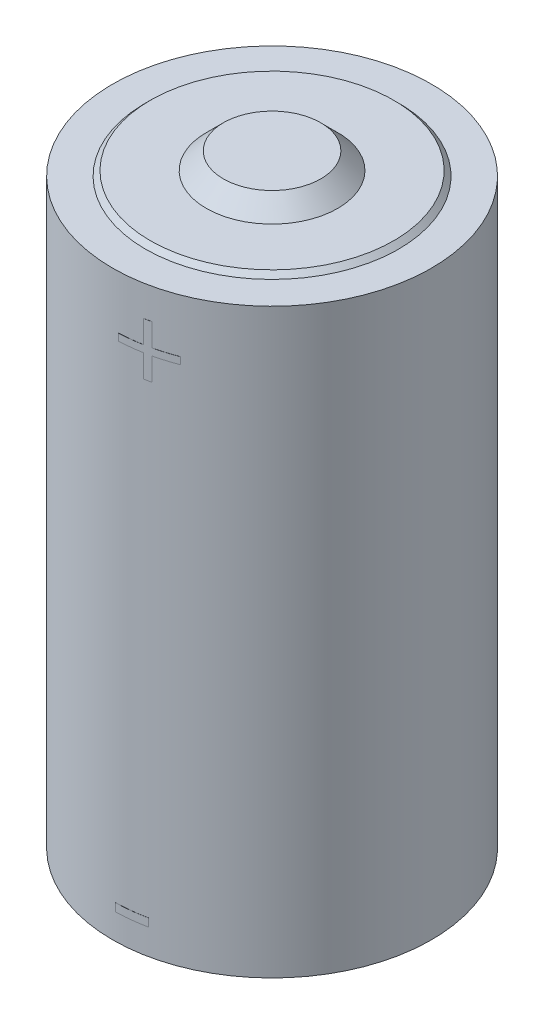
ISO-10303-21;
HEADER;
FILE_DESCRIPTION(('STEP AP214'),'2;1');
FILE_NAME('part.step','',(''),(''),'','','');
FILE_SCHEMA(('AUTOMOTIVE_DESIGN { 1 0 10303 214 1 1 1 1 }'));
ENDSEC;
DATA;
#1=APPLICATION_CONTEXT('core data for automotive mechanical design processes');
#2=APPLICATION_PROTOCOL_DEFINITION('international standard','automotive_design',2000,#1);
#3=PRODUCT_CONTEXT('',#1,'mechanical');
#4=PRODUCT('Part','Part','',(#3));
#5=PRODUCT_RELATED_PRODUCT_CATEGORY('part','',(#4));
#6=PRODUCT_DEFINITION_FORMATION('','',#4);
#7=PRODUCT_DEFINITION_CONTEXT('part definition',#1,'design');
#8=PRODUCT_DEFINITION('design','',#6,#7);
#9=PRODUCT_DEFINITION_SHAPE('','',#8);
#10=(LENGTH_UNIT() NAMED_UNIT(*) SI_UNIT(.MILLI.,.METRE.));
#11=(NAMED_UNIT(*) PLANE_ANGLE_UNIT() SI_UNIT($,.RADIAN.));
#12=(NAMED_UNIT(*) SI_UNIT($,.STERADIAN.) SOLID_ANGLE_UNIT());
#13=UNCERTAINTY_MEASURE_WITH_UNIT(LENGTH_MEASURE(1.E-05),#10,'distance_accuracy_value','');
#14=(GEOMETRIC_REPRESENTATION_CONTEXT(3) GLOBAL_UNCERTAINTY_ASSIGNED_CONTEXT((#13)) GLOBAL_UNIT_ASSIGNED_CONTEXT((#10,
#11,#12)) REPRESENTATION_CONTEXT('',''));
#15=CARTESIAN_POINT('',(0.,0.,0.));
#16=DIRECTION('',(0.,0.,1.));
#17=DIRECTION('',(1.,0.,0.));
#18=AXIS2_PLACEMENT_3D('',#15,#16,#17);
#19=CARTESIAN_POINT('',(0.,0.,0.));
#20=DIRECTION('',(0.,1.,0.));
#21=DIRECTION('',(0.,0.,1.));
#22=AXIS2_PLACEMENT_3D('',#19,#20,#21);
#23=PLANE('',#22);
#24=CARTESIAN_POINT('',(0.,0.,0.));
#25=DIRECTION('',(0.,1.,0.));
#26=DIRECTION('',(0.,0.,1.));
#27=AXIS2_PLACEMENT_3D('',#24,#25,#26);
#28=CIRCLE('',#27,9.40000000000001);
#29=CARTESIAN_POINT('',(0.,0.,9.40000000000001));
#30=VERTEX_POINT('',#29);
#31=EDGE_CURVE('E13',#30,#30,#28,.T.);
#32=ORIENTED_EDGE('',*,*,#31,.T.);
#33=EDGE_LOOP('',(#32));
#34=FACE_BOUND('',#33,.T.);
#35=CARTESIAN_POINT('',(0.,0.,0.));
#36=DIRECTION('',(0.,1.,0.));
#37=DIRECTION('',(0.,0.,1.));
#38=AXIS2_PLACEMENT_3D('',#35,#36,#37);
#39=CIRCLE('',#38,13.1);
#40=CARTESIAN_POINT('',(0.,0.,13.1));
#41=VERTEX_POINT('',#40);
#42=EDGE_CURVE('E387',#41,#41,#39,.T.);
#43=ORIENTED_EDGE('',*,*,#42,.F.);
#44=EDGE_LOOP('',(#43));
#45=FACE_BOUND('',#44,.T.);
#46=ADVANCED_FACE('F98',(#34,#45),#23,.F.);
#47=CARTESIAN_POINT('',(0.,48.2,0.));
#48=DIRECTION('',(0.,1.,0.));
#49=DIRECTION('',(0.,0.,1.));
#50=AXIS2_PLACEMENT_3D('',#47,#48,#49);
#51=PLANE('',#50);
#52=CARTESIAN_POINT('',(0.,48.2,0.));
#53=DIRECTION('',(0.,1.,0.));
#54=DIRECTION('',(0.,0.,1.));
#55=AXIS2_PLACEMENT_3D('',#52,#53,#54);
#56=CIRCLE('',#55,5.4);
#57=CARTESIAN_POINT('',(0.,48.2,5.4));
#58=VERTEX_POINT('',#57);
#59=EDGE_CURVE('E391',#58,#58,#56,.F.);
#60=ORIENTED_EDGE('',*,*,#59,.T.);
#61=EDGE_LOOP('',(#60));
#62=FACE_BOUND('',#61,.T.);
#63=CARTESIAN_POINT('',(0.,48.2,0.));
#64=DIRECTION('',(0.,1.,0.));
#65=DIRECTION('',(0.,0.,1.));
#66=AXIS2_PLACEMENT_3D('',#63,#64,#65);
#67=CIRCLE('',#66,10.);
#68=CARTESIAN_POINT('',(0.,48.2,10.));
#69=VERTEX_POINT('',#68);
#70=EDGE_CURVE('E384',#69,#69,#67,.T.);
#71=ORIENTED_EDGE('',*,*,#70,.T.);
#72=EDGE_LOOP('',(#71));
#73=FACE_BOUND('',#72,.T.);
#74=ADVANCED_FACE('F408',(#62,#73),#51,.T.);
#75=CARTESIAN_POINT('',(0.,47.8,0.));
#76=DIRECTION('',(0.,1.,0.));
#77=DIRECTION('',(0.,0.,1.));
#78=AXIS2_PLACEMENT_3D('',#75,#76,#77);
#79=PLANE('',#78);
#80=CARTESIAN_POINT('',(0.,47.8,0.));
#81=DIRECTION('',(0.,1.,0.));
#82=DIRECTION('',(0.,0.,1.));
#83=AXIS2_PLACEMENT_3D('',#80,#81,#82);
#84=CIRCLE('',#83,10.4);
#85=CARTESIAN_POINT('',(0.,47.8,10.4));
#86=VERTEX_POINT('',#85);
#87=EDGE_CURVE('E106',#86,#86,#84,.F.);
#88=ORIENTED_EDGE('',*,*,#87,.T.);
#89=EDGE_LOOP('',(#88));
#90=FACE_BOUND('',#89,.T.);
#91=CARTESIAN_POINT('',(0.,47.8,0.));
#92=DIRECTION('',(0.,1.,0.));
#93=DIRECTION('',(0.,0.,1.));
#94=AXIS2_PLACEMENT_3D('',#91,#92,#93);
#95=CIRCLE('',#94,13.1);
#96=CARTESIAN_POINT('',(0.,47.8,13.1));
#97=VERTEX_POINT('',#96);
#98=EDGE_CURVE('E388',#97,#97,#95,.T.);
#99=ORIENTED_EDGE('',*,*,#98,.T.);
#100=EDGE_LOOP('',(#99));
#101=FACE_BOUND('',#100,.T.);
#102=ADVANCED_FACE('F398',(#90,#101),#79,.T.);
#103=CARTESIAN_POINT('',(0.,47.8,0.));
#104=DIRECTION('',(0.,-1.,0.));
#105=DIRECTION('',(0.,0.,-1.));
#106=AXIS2_PLACEMENT_3D('',#103,#104,#105);
#107=CYLINDRICAL_SURFACE('',#106,13.1);
#108=CARTESIAN_POINT('',(0.,2.76794871794873,0.));
#109=DIRECTION('',(0.,-1.,0.));
#110=DIRECTION('',(0.0186424901586206,0.,0.9998262136795));
#111=AXIS2_PLACEMENT_3D('',#108,#109,#110);
#112=CIRCLE('',#111,13.1);
#113=CARTESIAN_POINT('',(2.66774650354884,2.76794871794871,12.8254874602412));
#114=VERTEX_POINT('',#113);
#115=CARTESIAN_POINT('',(0.244216621077929,2.76794871794873,13.0977233992015));
#116=VERTEX_POINT('',#115);
#117=EDGE_CURVE('E233',#114,#116,#112,.T.);
#118=ORIENTED_EDGE('',*,*,#117,.F.);
#119=DIRECTION('',(0.,-1.,0.));
#120=VECTOR('',#119,1.);
#121=CARTESIAN_POINT('',(2.66774650354884,2.76794871794873,12.8254874602412));
#122=LINE('',#121,#120);
#123=CARTESIAN_POINT('',(2.66774650354884,2.11666666666668,12.8254874602411));
#124=VERTEX_POINT('',#123);
#125=EDGE_CURVE('E113',#114,#124,#122,.T.);
#126=ORIENTED_EDGE('',*,*,#125,.T.);
#127=CARTESIAN_POINT('',(0.,2.11666666666668,0.));
#128=DIRECTION('',(0.,-1.,0.));
#129=DIRECTION('',(0.0186424901586206,0.,0.9998262136795));
#130=AXIS2_PLACEMENT_3D('',#127,#128,#129);
#131=CIRCLE('',#130,13.1);
#132=CARTESIAN_POINT('',(0.244216621077929,2.11666666666668,13.0977233992015));
#133=VERTEX_POINT('',#132);
#134=EDGE_CURVE('E221',#124,#133,#131,.T.);
#135=ORIENTED_EDGE('',*,*,#134,.T.);
#136=DIRECTION('',(0.,1.,0.));
#137=VECTOR('',#136,1.);
#138=CARTESIAN_POINT('',(0.244216621077929,2.11666666666668,13.0977233992015));
#139=LINE('',#138,#137);
#140=EDGE_CURVE('E239',#133,#116,#139,.T.);
#141=ORIENTED_EDGE('',*,*,#140,.T.);
#142=EDGE_LOOP('',(#118,#126,#135,#141));
#143=FACE_BOUND('',#142,.T.);
#144=DIRECTION('',(0.,1.,0.));
#145=VECTOR('',#144,1.);
#146=CARTESIAN_POINT('',(2.34813797852245,40.9769230769231,12.8878333335678));
#147=LINE('',#146,#145);
#148=CARTESIAN_POINT('',(2.34813797852245,40.9769230769231,12.8878333335678));
#149=VERTEX_POINT('',#148);
#150=CARTESIAN_POINT('',(2.34813797852246,42.849358974359,12.8878333335678));
#151=VERTEX_POINT('',#150);
#152=EDGE_CURVE('E318',#149,#151,#147,.T.);
#153=ORIENTED_EDGE('',*,*,#152,.T.);
#154=CARTESIAN_POINT('',(0.,42.849358974359,0.));
#155=DIRECTION('',(0.,-1.,0.));
#156=DIRECTION('',(0.0372785006977015,0.,0.999304915121372));
#157=AXIS2_PLACEMENT_3D('',#154,#155,#156);
#158=CIRCLE('',#157,13.1);
#159=CARTESIAN_POINT('',(0.48834835913989,42.849358974359,13.09089438809));
#160=VERTEX_POINT('',#159);
#161=EDGE_CURVE('E314',#151,#160,#158,.T.);
#162=ORIENTED_EDGE('',*,*,#161,.T.);
#163=DIRECTION('',(0.,1.,0.));
#164=VECTOR('',#163,1.);
#165=CARTESIAN_POINT('',(0.48834835913989,42.849358974359,13.09089438809));
#166=LINE('',#165,#164);
#167=CARTESIAN_POINT('',(0.48834835913989,43.4192307692308,13.09089438809));
#168=VERTEX_POINT('',#167);
#169=EDGE_CURVE('E310',#160,#168,#166,.T.);
#170=ORIENTED_EDGE('',*,*,#169,.T.);
#171=CARTESIAN_POINT('',(0.,43.4192307692308,0.));
#172=DIRECTION('',(0.,-1.,0.));
#173=DIRECTION('',(0.0372785006977015,0.,0.999304915121372));
#174=AXIS2_PLACEMENT_3D('',#171,#172,#173);
#175=CIRCLE('',#174,13.1);
#176=CARTESIAN_POINT('',(2.34813797852245,43.4192307692308,12.8878333335678));
#177=VERTEX_POINT('',#176);
#178=EDGE_CURVE('E121',#177,#168,#175,.T.);
#179=ORIENTED_EDGE('',*,*,#178,.F.);
#180=DIRECTION('',(0.,1.,0.));
#181=VECTOR('',#180,1.);
#182=CARTESIAN_POINT('',(2.34813797852245,43.4192307692308,12.8878333335678));
#183=LINE('',#182,#181);
#184=CARTESIAN_POINT('',(2.34813797852245,45.2916666666667,12.8878333335678));
#185=VERTEX_POINT('',#184);
#186=EDGE_CURVE('E265',#177,#185,#183,.T.);
#187=ORIENTED_EDGE('',*,*,#186,.T.);
#188=CARTESIAN_POINT('',(0.,45.2916666666667,0.));
#189=DIRECTION('',(0.,-1.,0.));
#190=DIRECTION('',(0.179247173933012,0.,0.983804071264715));
#191=AXIS2_PLACEMENT_3D('',#188,#189,#190);
#192=CIRCLE('',#191,13.1);
#193=CARTESIAN_POINT('',(2.90638190945701,45.2916666666667,12.7735251280287));
#194=VERTEX_POINT('',#193);
#195=EDGE_CURVE('E346',#194,#185,#192,.T.);
#196=ORIENTED_EDGE('',*,*,#195,.F.);
#197=DIRECTION('',(0.,-1.,0.));
#198=VECTOR('',#197,1.);
#199=CARTESIAN_POINT('',(2.90638190945701,45.2916666666667,12.7735251280287));
#200=LINE('',#199,#198);
#201=CARTESIAN_POINT('',(2.90638190945701,43.4192307692308,12.7735251280287));
#202=VERTEX_POINT('',#201);
#203=EDGE_CURVE('E342',#194,#202,#200,.T.);
#204=ORIENTED_EDGE('',*,*,#203,.T.);
#205=CARTESIAN_POINT('',(0.,43.4192307692308,0.));
#206=DIRECTION('',(0.,-1.,0.));
#207=DIRECTION('',(0.221861214462367,0.,0.975078254047994));
#208=AXIS2_PLACEMENT_3D('',#205,#206,#207);
#209=CIRCLE('',#208,13.1);
#210=CARTESIAN_POINT('',(4.69630460592092,43.4192307692308,12.2292568477568));
#211=VERTEX_POINT('',#210);
#212=EDGE_CURVE('E338',#211,#202,#209,.T.);
#213=ORIENTED_EDGE('',*,*,#212,.F.);
#214=DIRECTION('',(0.,-1.,0.));
#215=VECTOR('',#214,1.);
#216=CARTESIAN_POINT('',(4.69630460592092,43.4192307692308,12.2292568477568));
#217=LINE('',#216,#215);
#218=CARTESIAN_POINT('',(4.69630460592093,42.849358974359,12.2292568477568));
#219=VERTEX_POINT('',#218);
#220=EDGE_CURVE('E334',#211,#219,#217,.T.);
#221=ORIENTED_EDGE('',*,*,#220,.T.);
#222=CARTESIAN_POINT('',(0.,42.849358974359,0.));
#223=DIRECTION('',(0.,-1.,0.));
#224=DIRECTION('',(0.221861214462369,0.,0.975078254047993));
#225=AXIS2_PLACEMENT_3D('',#222,#223,#224);
#226=CIRCLE('',#225,13.1);
#227=CARTESIAN_POINT('',(2.90638190945701,42.849358974359,12.7735251280287));
#228=VERTEX_POINT('',#227);
#229=EDGE_CURVE('E330',#219,#228,#226,.T.);
#230=ORIENTED_EDGE('',*,*,#229,.T.);
#231=DIRECTION('',(0.,-1.,0.));
#232=VECTOR('',#231,1.);
#233=CARTESIAN_POINT('',(2.90638190945701,42.849358974359,12.7735251280287));
#234=LINE('',#233,#232);
#235=CARTESIAN_POINT('',(2.90638190945702,40.9769230769231,12.7735251280287));
#236=VERTEX_POINT('',#235);
#237=EDGE_CURVE('E326',#228,#236,#234,.T.);
#238=ORIENTED_EDGE('',*,*,#237,.T.);
#239=CARTESIAN_POINT('',(0.,40.9769230769231,0.));
#240=DIRECTION('',(0.,-1.,0.));
#241=DIRECTION('',(0.179247173933012,0.,0.983804071264715));
#242=AXIS2_PLACEMENT_3D('',#239,#240,#241);
#243=CIRCLE('',#242,13.1);
#244=EDGE_CURVE('E322',#236,#149,#243,.T.);
#245=ORIENTED_EDGE('',*,*,#244,.T.);
#246=EDGE_LOOP('',(#153,#162,#170,#179,#187,#196,#204,#213,#221,#230,#238,#245));
#247=FACE_BOUND('',#246,.T.);
#248=ORIENTED_EDGE('',*,*,#98,.F.);
#249=EDGE_LOOP('',(#248));
#250=FACE_BOUND('',#249,.T.);
#251=ORIENTED_EDGE('',*,*,#42,.T.);
#252=EDGE_LOOP('',(#251));
#253=FACE_BOUND('',#252,.T.);
#254=ADVANCED_FACE('F230',(#143,#247,#250,#253),#107,.T.);
#255=CARTESIAN_POINT('',(0.,49.6,0.));
#256=DIRECTION('',(0.,1.,0.));
#257=DIRECTION('',(0.,0.,1.));
#258=AXIS2_PLACEMENT_3D('',#255,#256,#257);
#259=PLANE('',#258);
#260=CARTESIAN_POINT('',(0.,49.6,0.));
#261=DIRECTION('',(0.,1.,0.));
#262=DIRECTION('',(0.,0.,1.));
#263=AXIS2_PLACEMENT_3D('',#260,#261,#262);
#264=CIRCLE('',#263,4.);
#265=CARTESIAN_POINT('',(0.,49.6,4.));
#266=VERTEX_POINT('',#265);
#267=EDGE_CURVE('E381',#266,#266,#264,.T.);
#268=ORIENTED_EDGE('',*,*,#267,.T.);
#269=EDGE_LOOP('',(#268));
#270=FACE_BOUND('',#269,.T.);
#271=ADVANCED_FACE('F420',(#270),#259,.T.);
#272=CARTESIAN_POINT('',(0.,49.6,0.));
#273=DIRECTION('',(0.,-1.,0.));
#274=DIRECTION('',(0.,0.,-1.));
#275=AXIS2_PLACEMENT_3D('',#272,#273,#274);
#276=CONICAL_SURFACE('',#275,4.,0.78539816339744);
#277=ORIENTED_EDGE('',*,*,#59,.F.);
#278=EDGE_LOOP('',(#277));
#279=FACE_BOUND('',#278,.T.);
#280=ORIENTED_EDGE('',*,*,#267,.F.);
#281=EDGE_LOOP('',(#280));
#282=FACE_BOUND('',#281,.T.);
#283=ADVANCED_FACE('F405',(#279,#282),#276,.T.);
#284=CARTESIAN_POINT('',(0.,48.2,0.));
#285=DIRECTION('',(0.,-1.,0.));
#286=DIRECTION('',(0.,0.,-1.));
#287=AXIS2_PLACEMENT_3D('',#284,#285,#286);
#288=CONICAL_SURFACE('',#287,10.,0.78539816339745);
#289=ORIENTED_EDGE('',*,*,#87,.F.);
#290=EDGE_LOOP('',(#289));
#291=FACE_BOUND('',#290,.T.);
#292=ORIENTED_EDGE('',*,*,#70,.F.);
#293=EDGE_LOOP('',(#292));
#294=FACE_BOUND('',#293,.T.);
#295=ADVANCED_FACE('F401',(#291,#294),#288,.T.);
#296=CARTESIAN_POINT('',(0.,-0.4,0.));
#297=DIRECTION('',(0.,-1.,0.));
#298=DIRECTION('',(0.,0.,-1.));
#299=AXIS2_PLACEMENT_3D('',#296,#297,#298);
#300=PLANE('',#299);
#301=CARTESIAN_POINT('',(0.,-0.4,0.));
#302=DIRECTION('',(0.,-1.,0.));
#303=DIRECTION('',(0.,0.,-1.));
#304=AXIS2_PLACEMENT_3D('',#301,#302,#303);
#305=CIRCLE('',#304,9.);
#306=CARTESIAN_POINT('',(0.,-0.4,-9.));
#307=VERTEX_POINT('',#306);
#308=EDGE_CURVE('E377',#307,#307,#305,.T.);
#309=ORIENTED_EDGE('',*,*,#308,.T.);
#310=EDGE_LOOP('',(#309));
#311=FACE_BOUND('',#310,.T.);
#312=ADVANCED_FACE('F404',(#311),#300,.T.);
#313=CARTESIAN_POINT('',(0.,-0.400000000000001,0.));
#314=DIRECTION('',(0.,1.,0.));
#315=DIRECTION('',(0.,0.,1.));
#316=AXIS2_PLACEMENT_3D('',#313,#314,#315);
#317=CONICAL_SURFACE('',#316,9.,0.785398163397455);
#318=ORIENTED_EDGE('',*,*,#31,.F.);
#319=EDGE_LOOP('',(#318));
#320=FACE_BOUND('',#319,.T.);
#321=ORIENTED_EDGE('',*,*,#308,.F.);
#322=EDGE_LOOP('',(#321));
#323=FACE_BOUND('',#322,.T.);
#324=ADVANCED_FACE('F100',(#320,#323),#317,.T.);
#325=CARTESIAN_POINT('',(0.,42.849358974359,0.));
#326=DIRECTION('',(0.,1.,0.));
#327=DIRECTION('',(0.,0.,1.));
#328=AXIS2_PLACEMENT_3D('',#325,#326,#327);
#329=PLANE('',#328);
#330=DIRECTION('',(0.0372785006977015,0.,0.999304915121372));
#331=VECTOR('',#330,1.);
#332=CARTESIAN_POINT('',(0.48834835913989,42.849358974359,13.09089438809));
#333=LINE('',#332,#331);
#334=CARTESIAN_POINT('',(0.48872114414687,42.849358974359,13.1008874372412));
#335=VERTEX_POINT('',#334);
#336=EDGE_CURVE('E375',#160,#335,#333,.T.);
#337=ORIENTED_EDGE('',*,*,#336,.F.);
#338=ORIENTED_EDGE('',*,*,#161,.F.);
#339=DIRECTION('',(0.179247173933012,0.,0.983804071264715));
#340=VECTOR('',#339,1.);
#341=CARTESIAN_POINT('',(2.34813797852246,42.849358974359,12.8878333335678));
#342=LINE('',#341,#340);
#343=CARTESIAN_POINT('',(2.34993045026179,42.849358974359,12.8976713742804));
#344=VERTEX_POINT('',#343);
#345=EDGE_CURVE('E373',#151,#344,#342,.T.);
#346=ORIENTED_EDGE('',*,*,#345,.T.);
#347=CARTESIAN_POINT('',(0.,42.849358974359,0.));
#348=DIRECTION('',(0.,-1.,0.));
#349=DIRECTION('',(0.,0.,-1.));
#350=AXIS2_PLACEMENT_3D('',#347,#348,#349);
#351=CIRCLE('',#350,13.11);
#352=EDGE_CURVE('E303',#344,#335,#351,.T.);
#353=ORIENTED_EDGE('',*,*,#352,.T.);
#354=EDGE_LOOP('',(#337,#338,#346,#353));
#355=FACE_BOUND('',#354,.T.);
#356=ADVANCED_FACE('F476',(#355),#329,.F.);
#357=CARTESIAN_POINT('',(2.34813797852245,41.913141025641,12.8878333335678));
#358=DIRECTION('',(0.983804071264715,0.,-0.179247173933012));
#359=DIRECTION('',(0.,1.,0.));
#360=AXIS2_PLACEMENT_3D('',#357,#358,#359);
#361=PLANE('',#360);
#362=ORIENTED_EDGE('',*,*,#345,.F.);
#363=ORIENTED_EDGE('',*,*,#152,.F.);
#364=DIRECTION('',(0.179247173933012,0.,0.983804071264715));
#365=VECTOR('',#364,1.);
#366=CARTESIAN_POINT('',(2.34813797852245,40.9769230769231,12.8878333335678));
#367=LINE('',#366,#365);
#368=CARTESIAN_POINT('',(2.34993045026178,40.9769230769231,12.8976713742804));
#369=VERTEX_POINT('',#368);
#370=EDGE_CURVE('E371',#149,#369,#367,.T.);
#371=ORIENTED_EDGE('',*,*,#370,.T.);
#372=DIRECTION('',(0.,-1.,0.));
#373=VECTOR('',#372,1.);
#374=CARTESIAN_POINT('',(2.34993045026178,47.8,12.8976713742804));
#375=LINE('',#374,#373);
#376=EDGE_CURVE('E299',#369,#344,#375,.F.);
#377=ORIENTED_EDGE('',*,*,#376,.T.);
#378=EDGE_LOOP('',(#362,#363,#371,#377));
#379=FACE_BOUND('',#378,.T.);
#380=ADVANCED_FACE('F485',(#379),#361,.F.);
#381=CARTESIAN_POINT('',(0.,40.9769230769231,0.));
#382=DIRECTION('',(0.,1.,0.));
#383=DIRECTION('',(0.,0.,1.));
#384=AXIS2_PLACEMENT_3D('',#381,#382,#383);
#385=PLANE('',#384);
#386=ORIENTED_EDGE('',*,*,#370,.F.);
#387=ORIENTED_EDGE('',*,*,#244,.F.);
#388=DIRECTION('',(0.221861214462368,0.,0.975078254047994));
#389=VECTOR('',#388,1.);
#390=CARTESIAN_POINT('',(2.90638190945702,40.9769230769231,12.7735251280287));
#391=LINE('',#390,#389);
#392=CARTESIAN_POINT('',(2.90860052160164,40.9769230769231,12.7832759105692));
#393=VERTEX_POINT('',#392);
#394=EDGE_CURVE('E369',#236,#393,#391,.T.);
#395=ORIENTED_EDGE('',*,*,#394,.T.);
#396=CARTESIAN_POINT('',(0.,40.9769230769231,0.));
#397=DIRECTION('',(0.,-1.,0.));
#398=DIRECTION('',(0.,0.,-1.));
#399=AXIS2_PLACEMENT_3D('',#396,#397,#398);
#400=CIRCLE('',#399,13.11);
#401=EDGE_CURVE('E295',#393,#369,#400,.T.);
#402=ORIENTED_EDGE('',*,*,#401,.T.);
#403=EDGE_LOOP('',(#386,#387,#395,#402));
#404=FACE_BOUND('',#403,.T.);
#405=ADVANCED_FACE('F492',(#404),#385,.F.);
#406=CARTESIAN_POINT('',(2.90638190945701,41.913141025641,12.7735251280287));
#407=DIRECTION('',(-0.975078254047994,0.,0.221861214462367));
#408=DIRECTION('',(0.,-1.,0.));
#409=AXIS2_PLACEMENT_3D('',#406,#407,#408);
#410=PLANE('',#409);
#411=ORIENTED_EDGE('',*,*,#394,.F.);
#412=ORIENTED_EDGE('',*,*,#237,.F.);
#413=DIRECTION('',(0.221861214462367,0.,0.975078254047994));
#414=VECTOR('',#413,1.);
#415=CARTESIAN_POINT('',(2.90638190945701,42.849358974359,12.7735251280287));
#416=LINE('',#415,#414);
#417=CARTESIAN_POINT('',(2.90860052160163,42.849358974359,12.7832759105692));
#418=VERTEX_POINT('',#417);
#419=EDGE_CURVE('E367',#228,#418,#416,.T.);
#420=ORIENTED_EDGE('',*,*,#419,.T.);
#421=DIRECTION('',(0.,-1.,0.));
#422=VECTOR('',#421,1.);
#423=CARTESIAN_POINT('',(2.90860052160163,47.8,12.7832759105692));
#424=LINE('',#423,#422);
#425=EDGE_CURVE('E291',#418,#393,#424,.T.);
#426=ORIENTED_EDGE('',*,*,#425,.T.);
#427=EDGE_LOOP('',(#411,#412,#420,#426));
#428=FACE_BOUND('',#427,.T.);
#429=ADVANCED_FACE('F500',(#428),#410,.F.);
#430=CARTESIAN_POINT('',(0.,42.849358974359,0.));
#431=DIRECTION('',(0.,1.,0.));
#432=DIRECTION('',(0.,0.,1.));
#433=AXIS2_PLACEMENT_3D('',#430,#431,#432);
#434=PLANE('',#433);
#435=ORIENTED_EDGE('',*,*,#419,.F.);
#436=ORIENTED_EDGE('',*,*,#229,.F.);
#437=DIRECTION('',(0.358496534803124,0.,0.93353105708067));
#438=VECTOR('',#437,1.);
#439=CARTESIAN_POINT('',(4.69630460592093,42.849358974359,12.2292568477568));
#440=LINE('',#439,#438);
#441=CARTESIAN_POINT('',(4.69988957126896,42.849358974359,12.2385921583276));
#442=VERTEX_POINT('',#441);
#443=EDGE_CURVE('E365',#219,#442,#440,.T.);
#444=ORIENTED_EDGE('',*,*,#443,.T.);
#445=CARTESIAN_POINT('',(0.,42.849358974359,0.));
#446=DIRECTION('',(0.,-1.,0.));
#447=DIRECTION('',(0.,0.,-1.));
#448=AXIS2_PLACEMENT_3D('',#445,#446,#447);
#449=CIRCLE('',#448,13.11);
#450=EDGE_CURVE('E287',#442,#418,#449,.T.);
#451=ORIENTED_EDGE('',*,*,#450,.T.);
#452=EDGE_LOOP('',(#435,#436,#444,#451));
#453=FACE_BOUND('',#452,.T.);
#454=ADVANCED_FACE('F508',(#453),#434,.F.);
#455=CARTESIAN_POINT('',(4.69630460592092,43.1342948717949,12.2292568477568));
#456=DIRECTION('',(-0.93353105708067,0.,0.358496534803124));
#457=DIRECTION('',(0.,-1.,0.));
#458=AXIS2_PLACEMENT_3D('',#455,#456,#457);
#459=PLANE('',#458);
#460=ORIENTED_EDGE('',*,*,#443,.F.);
#461=ORIENTED_EDGE('',*,*,#220,.F.);
#462=DIRECTION('',(0.358496534803124,0.,0.93353105708067));
#463=VECTOR('',#462,1.);
#464=CARTESIAN_POINT('',(4.69630460592092,43.4192307692308,12.2292568477568));
#465=LINE('',#464,#463);
#466=CARTESIAN_POINT('',(4.69988957126895,43.4192307692308,12.2385921583276));
#467=VERTEX_POINT('',#466);
#468=EDGE_CURVE('E363',#211,#467,#465,.T.);
#469=ORIENTED_EDGE('',*,*,#468,.T.);
#470=DIRECTION('',(0.,-1.,0.));
#471=VECTOR('',#470,1.);
#472=CARTESIAN_POINT('',(4.69988957126895,47.8,12.2385921583276));
#473=LINE('',#472,#471);
#474=EDGE_CURVE('E283',#467,#442,#473,.T.);
#475=ORIENTED_EDGE('',*,*,#474,.T.);
#476=EDGE_LOOP('',(#460,#461,#469,#475));
#477=FACE_BOUND('',#476,.T.);
#478=ADVANCED_FACE('F516',(#477),#459,.F.);
#479=CARTESIAN_POINT('',(0.,43.4192307692308,0.));
#480=DIRECTION('',(0.,1.,0.));
#481=DIRECTION('',(0.,0.,1.));
#482=AXIS2_PLACEMENT_3D('',#479,#480,#481);
#483=PLANE('',#482);
#484=ORIENTED_EDGE('',*,*,#468,.F.);
#485=ORIENTED_EDGE('',*,*,#212,.T.);
#486=DIRECTION('',(0.221861214462367,0.,0.975078254047994));
#487=VECTOR('',#486,1.);
#488=CARTESIAN_POINT('',(2.90638190945701,43.4192307692308,12.7735251280287));
#489=LINE('',#488,#487);
#490=CARTESIAN_POINT('',(2.90860052160163,43.4192307692308,12.7832759105692));
#491=VERTEX_POINT('',#490);
#492=EDGE_CURVE('E361',#202,#491,#489,.T.);
#493=ORIENTED_EDGE('',*,*,#492,.T.);
#494=CARTESIAN_POINT('',(0.,43.4192307692308,0.));
#495=DIRECTION('',(0.,-1.,0.));
#496=DIRECTION('',(0.,0.,-1.));
#497=AXIS2_PLACEMENT_3D('',#494,#495,#496);
#498=CIRCLE('',#497,13.11);
#499=EDGE_CURVE('E279',#467,#491,#498,.T.);
#500=ORIENTED_EDGE('',*,*,#499,.F.);
#501=EDGE_LOOP('',(#484,#485,#493,#500));
#502=FACE_BOUND('',#501,.T.);
#503=ADVANCED_FACE('F524',(#502),#483,.T.);
#504=CARTESIAN_POINT('',(2.90638190945701,44.3554487179487,12.7735251280287));
#505=DIRECTION('',(-0.975078254047994,0.,0.221861214462367));
#506=DIRECTION('',(0.,-1.,0.));
#507=AXIS2_PLACEMENT_3D('',#504,#505,#506);
#508=PLANE('',#507);
#509=ORIENTED_EDGE('',*,*,#492,.F.);
#510=ORIENTED_EDGE('',*,*,#203,.F.);
#511=DIRECTION('',(0.221861214462367,0.,0.975078254047994));
#512=VECTOR('',#511,1.);
#513=CARTESIAN_POINT('',(2.90638190945701,45.2916666666667,12.7735251280287));
#514=LINE('',#513,#512);
#515=CARTESIAN_POINT('',(2.90860052160163,45.2916666666667,12.7832759105692));
#516=VERTEX_POINT('',#515);
#517=EDGE_CURVE('E359',#194,#516,#514,.T.);
#518=ORIENTED_EDGE('',*,*,#517,.T.);
#519=DIRECTION('',(0.,-1.,0.));
#520=VECTOR('',#519,1.);
#521=CARTESIAN_POINT('',(2.90860052160163,47.8,12.7832759105692));
#522=LINE('',#521,#520);
#523=EDGE_CURVE('E275',#516,#491,#522,.T.);
#524=ORIENTED_EDGE('',*,*,#523,.T.);
#525=EDGE_LOOP('',(#509,#510,#518,#524));
#526=FACE_BOUND('',#525,.T.);
#527=ADVANCED_FACE('F532',(#526),#508,.F.);
#528=CARTESIAN_POINT('',(0.,45.2916666666667,0.));
#529=DIRECTION('',(0.,1.,0.));
#530=DIRECTION('',(0.,0.,1.));
#531=AXIS2_PLACEMENT_3D('',#528,#529,#530);
#532=PLANE('',#531);
#533=ORIENTED_EDGE('',*,*,#517,.F.);
#534=ORIENTED_EDGE('',*,*,#195,.T.);
#535=DIRECTION('',(0.179247173933012,0.,0.983804071264715));
#536=VECTOR('',#535,1.);
#537=CARTESIAN_POINT('',(2.34813797852245,45.2916666666667,12.8878333335678));
#538=LINE('',#537,#536);
#539=CARTESIAN_POINT('',(2.34993045026178,45.2916666666667,12.8976713742804));
#540=VERTEX_POINT('',#539);
#541=EDGE_CURVE('E357',#185,#540,#538,.T.);
#542=ORIENTED_EDGE('',*,*,#541,.T.);
#543=CARTESIAN_POINT('',(0.,45.2916666666667,0.));
#544=DIRECTION('',(0.,-1.,0.));
#545=DIRECTION('',(0.,0.,-1.));
#546=AXIS2_PLACEMENT_3D('',#543,#544,#545);
#547=CIRCLE('',#546,13.11);
#548=EDGE_CURVE('E271',#516,#540,#547,.T.);
#549=ORIENTED_EDGE('',*,*,#548,.F.);
#550=EDGE_LOOP('',(#533,#534,#542,#549));
#551=FACE_BOUND('',#550,.T.);
#552=ADVANCED_FACE('F540',(#551),#532,.T.);
#553=CARTESIAN_POINT('',(2.34813797852245,44.3554487179487,12.8878333335678));
#554=DIRECTION('',(0.983804071264715,0.,-0.179247173933012));
#555=DIRECTION('',(0.,1.,0.));
#556=AXIS2_PLACEMENT_3D('',#553,#554,#555);
#557=PLANE('',#556);
#558=ORIENTED_EDGE('',*,*,#541,.F.);
#559=ORIENTED_EDGE('',*,*,#186,.F.);
#560=DIRECTION('',(0.179247173933012,0.,0.983804071264715));
#561=VECTOR('',#560,1.);
#562=CARTESIAN_POINT('',(2.34813797852245,43.4192307692308,12.8878333335678));
#563=LINE('',#562,#561);
#564=CARTESIAN_POINT('',(2.34993045026178,43.4192307692308,12.8976713742804));
#565=VERTEX_POINT('',#564);
#566=EDGE_CURVE('E355',#177,#565,#563,.T.);
#567=ORIENTED_EDGE('',*,*,#566,.T.);
#568=DIRECTION('',(0.,-1.,0.));
#569=VECTOR('',#568,1.);
#570=CARTESIAN_POINT('',(2.34993045026178,47.8,12.8976713742804));
#571=LINE('',#570,#569);
#572=EDGE_CURVE('E266',#565,#540,#571,.F.);
#573=ORIENTED_EDGE('',*,*,#572,.T.);
#574=EDGE_LOOP('',(#558,#559,#567,#573));
#575=FACE_BOUND('',#574,.T.);
#576=ADVANCED_FACE('F548',(#575),#557,.F.);
#577=CARTESIAN_POINT('',(0.,43.4192307692308,0.));
#578=DIRECTION('',(0.,1.,0.));
#579=DIRECTION('',(0.,0.,1.));
#580=AXIS2_PLACEMENT_3D('',#577,#578,#579);
#581=PLANE('',#580);
#582=ORIENTED_EDGE('',*,*,#566,.F.);
#583=ORIENTED_EDGE('',*,*,#178,.T.);
#584=DIRECTION('',(0.0372785006977015,0.,0.999304915121372));
#585=VECTOR('',#584,1.);
#586=CARTESIAN_POINT('',(0.48834835913989,43.4192307692308,13.09089438809));
#587=LINE('',#586,#585);
#588=CARTESIAN_POINT('',(0.48872114414687,43.4192307692308,13.1008874372412));
#589=VERTEX_POINT('',#588);
#590=EDGE_CURVE('E270',#168,#589,#587,.T.);
#591=ORIENTED_EDGE('',*,*,#590,.T.);
#592=CARTESIAN_POINT('',(0.,43.4192307692308,0.));
#593=DIRECTION('',(0.,-1.,0.));
#594=DIRECTION('',(0.,0.,-1.));
#595=AXIS2_PLACEMENT_3D('',#592,#593,#594);
#596=CIRCLE('',#595,13.11);
#597=EDGE_CURVE('E260',#565,#589,#596,.T.);
#598=ORIENTED_EDGE('',*,*,#597,.F.);
#599=EDGE_LOOP('',(#582,#583,#591,#598));
#600=FACE_BOUND('',#599,.T.);
#601=ADVANCED_FACE('F556',(#600),#581,.T.);
#602=CARTESIAN_POINT('',(0.48834835913989,43.1342948717949,13.09089438809));
#603=DIRECTION('',(0.999304915121372,0.,-0.0372785006977015));
#604=DIRECTION('',(0.,1.,0.));
#605=AXIS2_PLACEMENT_3D('',#602,#603,#604);
#606=PLANE('',#605);
#607=ORIENTED_EDGE('',*,*,#169,.F.);
#608=ORIENTED_EDGE('',*,*,#336,.T.);
#609=DIRECTION('',(0.,-1.,0.));
#610=VECTOR('',#609,1.);
#611=CARTESIAN_POINT('',(0.48872114414687,47.8,13.1008874372412));
#612=LINE('',#611,#610);
#613=EDGE_CURVE('E264',#335,#589,#612,.F.);
#614=ORIENTED_EDGE('',*,*,#613,.T.);
#615=ORIENTED_EDGE('',*,*,#590,.F.);
#616=EDGE_LOOP('',(#607,#608,#614,#615));
#617=FACE_BOUND('',#616,.T.);
#618=ADVANCED_FACE('F564',(#617),#606,.F.);
#619=CARTESIAN_POINT('',(0.,47.8,0.));
#620=DIRECTION('',(0.,-1.,0.));
#621=DIRECTION('',(0.,0.,-1.));
#622=AXIS2_PLACEMENT_3D('',#619,#620,#621);
#623=CYLINDRICAL_SURFACE('',#622,13.11);
#624=ORIENTED_EDGE('',*,*,#597,.T.);
#625=ORIENTED_EDGE('',*,*,#613,.F.);
#626=ORIENTED_EDGE('',*,*,#352,.F.);
#627=ORIENTED_EDGE('',*,*,#376,.F.);
#628=ORIENTED_EDGE('',*,*,#401,.F.);
#629=ORIENTED_EDGE('',*,*,#425,.F.);
#630=ORIENTED_EDGE('',*,*,#450,.F.);
#631=ORIENTED_EDGE('',*,*,#474,.F.);
#632=ORIENTED_EDGE('',*,*,#499,.T.);
#633=ORIENTED_EDGE('',*,*,#523,.F.);
#634=ORIENTED_EDGE('',*,*,#548,.T.);
#635=ORIENTED_EDGE('',*,*,#572,.F.);
#636=EDGE_LOOP('',(#624,#625,#626,#627,#628,#629,#630,#631,#632,#633,#634,#635));
#637=FACE_BOUND('',#636,.T.);
#638=ADVANCED_FACE('F571',(#637),#623,.T.);
#639=CARTESIAN_POINT('',(2.66774650354884,2.44230769230771,12.8254874602412));
#640=DIRECTION('',(-0.979044844293217,0.,0.20364477126327));
#641=DIRECTION('',(0.,-1.,0.));
#642=AXIS2_PLACEMENT_3D('',#639,#640,#641);
#643=PLANE('',#642);
#644=DIRECTION('',(-0.20364477126327,0.,-0.979044844293217));
#645=VECTOR('',#644,1.);
#646=CARTESIAN_POINT('',(2.66774650354884,2.76794871794873,12.8254874602412));
#647=LINE('',#646,#645);
#648=CARTESIAN_POINT('',(2.66978295126147,2.76794871794875,12.8352779086841));
#649=VERTEX_POINT('',#648);
#650=EDGE_CURVE('E217',#649,#114,#647,.T.);
#651=ORIENTED_EDGE('',*,*,#650,.F.);
#652=DIRECTION('',(0.,-1.,0.));
#653=VECTOR('',#652,1.);
#654=CARTESIAN_POINT('',(2.66978295126147,47.8,12.8352779086841));
#655=LINE('',#654,#653);
#656=CARTESIAN_POINT('',(2.66978295126148,2.1166666666667,12.8352779086841));
#657=VERTEX_POINT('',#656);
#658=EDGE_CURVE('E213',#649,#657,#655,.T.);
#659=ORIENTED_EDGE('',*,*,#658,.T.);
#660=DIRECTION('',(-0.20364477126327,0.,-0.979044844293217));
#661=VECTOR('',#660,1.);
#662=CARTESIAN_POINT('',(2.66774650354884,2.11666666666668,12.8254874602411));
#663=LINE('',#662,#661);
#664=EDGE_CURVE('E209',#657,#124,#663,.T.);
#665=ORIENTED_EDGE('',*,*,#664,.T.);
#666=ORIENTED_EDGE('',*,*,#125,.F.);
#667=EDGE_LOOP('',(#651,#659,#665,#666));
#668=FACE_BOUND('',#667,.T.);
#669=ADVANCED_FACE('F211',(#668),#643,.F.);
#670=CARTESIAN_POINT('',(0.,2.11666666666668,0.));
#671=DIRECTION('',(0.,1.,0.));
#672=DIRECTION('',(0.,0.,1.));
#673=AXIS2_PLACEMENT_3D('',#670,#671,#672);
#674=PLANE('',#673);
#675=ORIENTED_EDGE('',*,*,#664,.F.);
#676=CARTESIAN_POINT('',(0.,2.1166666666667,0.));
#677=DIRECTION('',(0.,-1.,0.));
#678=DIRECTION('',(0.,0.,-1.));
#679=AXIS2_PLACEMENT_3D('',#676,#677,#678);
#680=CIRCLE('',#679,13.11);
#681=CARTESIAN_POINT('',(0.244403045979518,2.1166666666667,13.1077216613383));
#682=VERTEX_POINT('',#681);
#683=EDGE_CURVE('E244',#657,#682,#680,.T.);
#684=ORIENTED_EDGE('',*,*,#683,.T.);
#685=DIRECTION('',(-0.0186424901586206,0.,-0.9998262136795));
#686=VECTOR('',#685,1.);
#687=CARTESIAN_POINT('',(0.244216621077929,2.11666666666668,13.0977233992015));
#688=LINE('',#687,#686);
#689=EDGE_CURVE('E218',#682,#133,#688,.T.);
#690=ORIENTED_EDGE('',*,*,#689,.T.);
#691=ORIENTED_EDGE('',*,*,#134,.F.);
#692=EDGE_LOOP('',(#675,#684,#690,#691));
#693=FACE_BOUND('',#692,.T.);
#694=ADVANCED_FACE('F222',(#693),#674,.F.);
#695=CARTESIAN_POINT('',(0.244216621077929,2.44230769230771,13.0977233992015));
#696=DIRECTION('',(0.9998262136795,0.,-0.0186424901586206));
#697=DIRECTION('',(0.,1.,0.));
#698=AXIS2_PLACEMENT_3D('',#695,#696,#697);
#699=PLANE('',#698);
#700=ORIENTED_EDGE('',*,*,#689,.F.);
#701=DIRECTION('',(0.,-1.,0.));
#702=VECTOR('',#701,1.);
#703=CARTESIAN_POINT('',(0.244403045979518,47.8,13.1077216613383));
#704=LINE('',#703,#702);
#705=CARTESIAN_POINT('',(0.244403045979518,2.76794871794875,13.1077216613383));
#706=VERTEX_POINT('',#705);
#707=EDGE_CURVE('E245',#682,#706,#704,.F.);
#708=ORIENTED_EDGE('',*,*,#707,.T.);
#709=DIRECTION('',(-0.0186424901586206,0.,-0.9998262136795));
#710=VECTOR('',#709,1.);
#711=CARTESIAN_POINT('',(0.244216621077929,2.76794871794873,13.0977233992015));
#712=LINE('',#711,#710);
#713=EDGE_CURVE('E227',#706,#116,#712,.T.);
#714=ORIENTED_EDGE('',*,*,#713,.T.);
#715=ORIENTED_EDGE('',*,*,#140,.F.);
#716=EDGE_LOOP('',(#700,#708,#714,#715));
#717=FACE_BOUND('',#716,.T.);
#718=ADVANCED_FACE('F592',(#717),#699,.F.);
#719=CARTESIAN_POINT('',(0.,2.76794871794873,0.));
#720=DIRECTION('',(0.,1.,0.));
#721=DIRECTION('',(0.,0.,1.));
#722=AXIS2_PLACEMENT_3D('',#719,#720,#721);
#723=PLANE('',#722);
#724=CARTESIAN_POINT('',(0.,2.76794871794875,0.));
#725=DIRECTION('',(0.,-1.,0.));
#726=DIRECTION('',(0.,0.,-1.));
#727=AXIS2_PLACEMENT_3D('',#724,#725,#726);
#728=CIRCLE('',#727,13.11);
#729=EDGE_CURVE('E249',#649,#706,#728,.T.);
#730=ORIENTED_EDGE('',*,*,#729,.F.);
#731=ORIENTED_EDGE('',*,*,#650,.T.);
#732=ORIENTED_EDGE('',*,*,#117,.T.);
#733=ORIENTED_EDGE('',*,*,#713,.F.);
#734=EDGE_LOOP('',(#730,#731,#732,#733));
#735=FACE_BOUND('',#734,.T.);
#736=ADVANCED_FACE('F599',(#735),#723,.T.);
#737=CARTESIAN_POINT('',(0.,47.8,0.));
#738=DIRECTION('',(0.,-1.,0.));
#739=DIRECTION('',(0.,0.,-1.));
#740=AXIS2_PLACEMENT_3D('',#737,#738,#739);
#741=CYLINDRICAL_SURFACE('',#740,13.11);
#742=ORIENTED_EDGE('',*,*,#707,.F.);
#743=ORIENTED_EDGE('',*,*,#683,.F.);
#744=ORIENTED_EDGE('',*,*,#658,.F.);
#745=ORIENTED_EDGE('',*,*,#729,.T.);
#746=EDGE_LOOP('',(#742,#743,#744,#745));
#747=FACE_BOUND('',#746,.T.);
#748=ADVANCED_FACE('F607',(#747),#741,.T.);
#749=CLOSED_SHELL('',(#46,#74,#102,#254,#271,#283,#295,#312,#324,#356,#380,#405,#429,#454,#478,
#503,#527,#552,#576,#601,#618,#638,#669,#694,#718,#736,#748));
#750=MANIFOLD_SOLID_BREP('B2',#749);
#751=ADVANCED_BREP_SHAPE_REPRESENTATION('',(#18,#750),#14);
#752=SHAPE_DEFINITION_REPRESENTATION(#9,#751);
ENDSEC;
END-ISO-10303-21;
